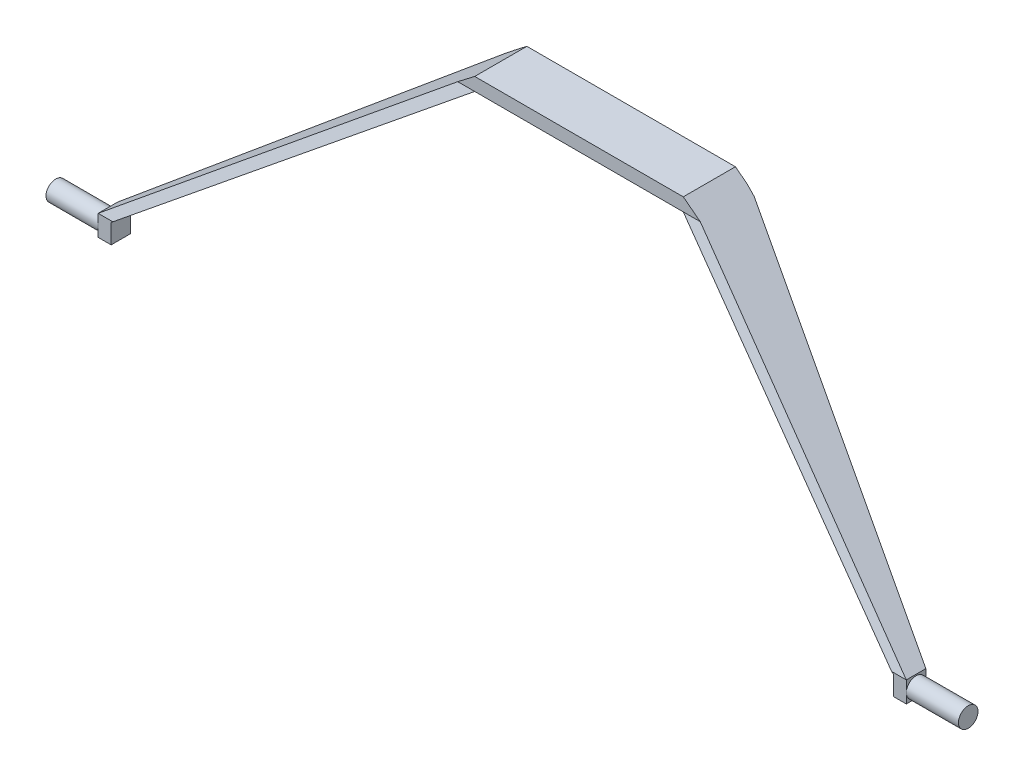
ISO-10303-21;
HEADER;
FILE_DESCRIPTION(('STEP AP214'),'2;1');
FILE_NAME('part.step','',(''),(''),'','','');
FILE_SCHEMA(('AUTOMOTIVE_DESIGN { 1 0 10303 214 1 1 1 1 }'));
ENDSEC;
DATA;
#1=APPLICATION_CONTEXT('core data for automotive mechanical design processes');
#2=APPLICATION_PROTOCOL_DEFINITION('international standard','automotive_design',2000,#1);
#3=PRODUCT_CONTEXT('',#1,'mechanical');
#4=PRODUCT('Part','Part','',(#3));
#5=PRODUCT_RELATED_PRODUCT_CATEGORY('part','',(#4));
#6=PRODUCT_DEFINITION_FORMATION('','',#4);
#7=PRODUCT_DEFINITION_CONTEXT('part definition',#1,'design');
#8=PRODUCT_DEFINITION('design','',#6,#7);
#9=PRODUCT_DEFINITION_SHAPE('','',#8);
#10=(LENGTH_UNIT() NAMED_UNIT(*) SI_UNIT(.MILLI.,.METRE.));
#11=(NAMED_UNIT(*) PLANE_ANGLE_UNIT() SI_UNIT($,.RADIAN.));
#12=(NAMED_UNIT(*) SI_UNIT($,.STERADIAN.) SOLID_ANGLE_UNIT());
#13=UNCERTAINTY_MEASURE_WITH_UNIT(LENGTH_MEASURE(1.E-05),#10,'distance_accuracy_value','');
#14=(GEOMETRIC_REPRESENTATION_CONTEXT(3) GLOBAL_UNCERTAINTY_ASSIGNED_CONTEXT((#13)) GLOBAL_UNIT_ASSIGNED_CONTEXT((#10,
#11,#12)) REPRESENTATION_CONTEXT('',''));
#15=CARTESIAN_POINT('',(0.,0.,0.));
#16=DIRECTION('',(0.,0.,1.));
#17=DIRECTION('',(1.,0.,0.));
#18=AXIS2_PLACEMENT_3D('',#15,#16,#17);
#19=CARTESIAN_POINT('',(0.,0.,149.606));
#20=DIRECTION('',(0.,0.,1.));
#21=DIRECTION('',(1.,0.,0.));
#22=AXIS2_PLACEMENT_3D('',#19,#20,#21);
#23=PLANE('',#22);
#24=DIRECTION('',(1.,0.,0.));
#25=VECTOR('',#24,1.);
#26=CARTESIAN_POINT('',(-1119.76296506094,-207.01,149.606));
#27=LINE('',#26,#25);
#28=CARTESIAN_POINT('',(-787.4,-207.01,149.606));
#29=VERTEX_POINT('',#28);
#30=CARTESIAN_POINT('',(-758.735116505832,-207.01,149.606));
#31=VERTEX_POINT('',#30);
#32=EDGE_CURVE('E213',#29,#31,#27,.T.);
#33=ORIENTED_EDGE('',*,*,#32,.F.);
#34=DIRECTION('',(-0.0017633769855496,-0.999998445249595,0.));
#35=VECTOR('',#34,1.);
#36=CARTESIAN_POINT('',(-787.4,-207.01,149.606));
#37=LINE('',#36,#35);
#38=CARTESIAN_POINT('',(-787.438071420537,-228.600029617996,149.606));
#39=VERTEX_POINT('',#38);
#40=EDGE_CURVE('E273',#29,#39,#37,.T.);
#41=ORIENTED_EDGE('',*,*,#40,.T.);
#42=CARTESIAN_POINT('',(-787.471663752112,-247.65,149.606));
#43=VERTEX_POINT('',#42);
#44=EDGE_CURVE('E268',#39,#43,#37,.T.);
#45=ORIENTED_EDGE('',*,*,#44,.T.);
#46=DIRECTION('',(1.,0.,0.));
#47=VECTOR('',#46,1.);
#48=CARTESIAN_POINT('',(-787.471663752112,-247.65,149.606));
#49=LINE('',#48,#47);
#50=CARTESIAN_POINT('',(-762.071663752112,-247.65,149.606));
#51=VERTEX_POINT('',#50);
#52=EDGE_CURVE('E276',#43,#51,#49,.T.);
#53=ORIENTED_EDGE('',*,*,#52,.T.);
#54=DIRECTION('',(0.,1.,0.));
#55=VECTOR('',#54,1.);
#56=CARTESIAN_POINT('',(-762.071663752112,-247.65,149.606));
#57=LINE('',#56,#55);
#58=CARTESIAN_POINT('',(-762.071663752113,-209.55,149.606));
#59=VERTEX_POINT('',#58);
#60=EDGE_CURVE('E279',#51,#59,#57,.T.);
#61=ORIENTED_EDGE('',*,*,#60,.T.);
#62=DIRECTION('',(0.795676661320879,0.605721594983421,0.));
#63=VECTOR('',#62,1.);
#64=CARTESIAN_POINT('',(-762.071663752113,-209.55,149.606));
#65=LINE('',#64,#63);
#66=EDGE_CURVE('E282',#59,#31,#65,.T.);
#67=ORIENTED_EDGE('',*,*,#66,.T.);
#68=EDGE_LOOP('',(#33,#41,#45,#53,#61,#67));
#69=FACE_BOUND('',#68,.T.);
#70=ADVANCED_FACE('F40',(#69),#23,.T.);
#71=CARTESIAN_POINT('',(787.471663752112,-247.65,149.606));
#72=DIRECTION('',(-0.999998445249595,-0.0017633769855496,0.));
#73=DIRECTION('',(0.0017633769855496,-0.999998445249595,0.));
#74=AXIS2_PLACEMENT_3D('',#71,#72,#73);
#75=PLANE('',#74);
#76=DIRECTION('',(0.,0.,-1.));
#77=VECTOR('',#76,1.);
#78=CARTESIAN_POINT('',(787.471663752112,-247.65,11.43));
#79=LINE('',#78,#77);
#80=CARTESIAN_POINT('',(787.471663752112,-247.65,130.556));
#81=VERTEX_POINT('',#80);
#82=CARTESIAN_POINT('',(787.471663752112,-247.65,111.506));
#83=VERTEX_POINT('',#82);
#84=EDGE_CURVE('E342',#81,#83,#79,.T.);
#85=ORIENTED_EDGE('',*,*,#84,.T.);
#86=DIRECTION('',(-0.0017633769855496,0.999998445249595,0.));
#87=VECTOR('',#86,1.);
#88=CARTESIAN_POINT('',(787.471663752112,-247.65,111.506));
#89=LINE('',#88,#87);
#90=CARTESIAN_POINT('',(787.438071420537,-228.600029617996,111.506));
#91=VERTEX_POINT('',#90);
#92=EDGE_CURVE('E241',#83,#91,#89,.T.);
#93=ORIENTED_EDGE('',*,*,#92,.T.);
#94=CARTESIAN_POINT('',(787.438071420537,-228.600029617996,130.556));
#95=DIRECTION('',(0.999998445249595,0.0017633769855496,0.));
#96=DIRECTION('',(-0.0017633769855496,0.999998445249595,0.));
#97=AXIS2_PLACEMENT_3D('',#94,#95,#96);
#98=CIRCLE('',#97,19.05);
#99=EDGE_CURVE('E272',#81,#91,#98,.T.);
#100=ORIENTED_EDGE('',*,*,#99,.F.);
#101=EDGE_LOOP('',(#85,#93,#100));
#102=FACE_BOUND('',#101,.T.);
#103=ADVANCED_FACE('F410',(#102),#75,.F.);
#104=CARTESIAN_POINT('',(-787.4,-207.01,149.606));
#105=DIRECTION('',(0.999998445249595,-0.0017633769855496,0.));
#106=DIRECTION('',(0.0017633769855496,0.999998445249595,0.));
#107=AXIS2_PLACEMENT_3D('',#104,#105,#106);
#108=PLANE('',#107);
#109=DIRECTION('',(0.,0.,-1.));
#110=VECTOR('',#109,1.);
#111=CARTESIAN_POINT('',(-787.4,-207.01,11.43));
#112=LINE('',#111,#110);
#113=CARTESIAN_POINT('',(-787.4,-207.01,111.506));
#114=VERTEX_POINT('',#113);
#115=EDGE_CURVE('E334',#29,#114,#112,.T.);
#116=ORIENTED_EDGE('',*,*,#115,.T.);
#117=DIRECTION('',(-0.0017633769855496,-0.999998445249595,0.));
#118=VECTOR('',#117,1.);
#119=CARTESIAN_POINT('',(-787.4,-207.01,111.506));
#120=LINE('',#119,#118);
#121=CARTESIAN_POINT('',(-787.438071420537,-228.600029617996,111.506));
#122=VERTEX_POINT('',#121);
#123=EDGE_CURVE('E238',#114,#122,#120,.T.);
#124=ORIENTED_EDGE('',*,*,#123,.T.);
#125=CARTESIAN_POINT('',(-787.438071420537,-228.600029617996,130.556));
#126=DIRECTION('',(0.999998445249595,-0.0017633769855496,0.));
#127=DIRECTION('',(0.0017633769855496,0.999998445249595,0.));
#128=AXIS2_PLACEMENT_3D('',#125,#126,#127);
#129=CIRCLE('',#128,19.05);
#130=EDGE_CURVE('E256',#122,#39,#129,.T.);
#131=ORIENTED_EDGE('',*,*,#130,.T.);
#132=ORIENTED_EDGE('',*,*,#40,.F.);
#133=EDGE_LOOP('',(#116,#124,#131,#132));
#134=FACE_BOUND('',#133,.T.);
#135=ADVANCED_FACE('F392',(#134),#108,.F.);
#136=ORIENTED_EDGE('',*,*,#44,.F.);
#137=CARTESIAN_POINT('',(-787.471663752112,-247.65,130.556));
#138=VERTEX_POINT('',#137);
#139=EDGE_CURVE('E261',#39,#138,#129,.T.);
#140=ORIENTED_EDGE('',*,*,#139,.T.);
#141=DIRECTION('',(0.,0.,-1.));
#142=VECTOR('',#141,1.);
#143=CARTESIAN_POINT('',(-787.471663752112,-247.65,11.43));
#144=LINE('',#143,#142);
#145=EDGE_CURVE('E331',#43,#138,#144,.T.);
#146=ORIENTED_EDGE('',*,*,#145,.F.);
#147=EDGE_LOOP('',(#136,#140,#146));
#148=FACE_BOUND('',#147,.T.);
#149=ADVANCED_FACE('F399',(#148),#108,.F.);
#150=CARTESIAN_POINT('',(787.438071420537,-228.600029617996,149.606));
#151=VERTEX_POINT('',#150);
#152=EDGE_CURVE('E260',#91,#151,#98,.T.);
#153=ORIENTED_EDGE('',*,*,#152,.F.);
#154=CARTESIAN_POINT('',(787.4,-207.01,111.506));
#155=VERTEX_POINT('',#154);
#156=EDGE_CURVE('E237',#91,#155,#89,.T.);
#157=ORIENTED_EDGE('',*,*,#156,.T.);
#158=DIRECTION('',(0.,0.,-1.));
#159=VECTOR('',#158,1.);
#160=CARTESIAN_POINT('',(787.4,-207.01,11.43));
#161=LINE('',#160,#159);
#162=CARTESIAN_POINT('',(787.4,-207.01,149.606));
#163=VERTEX_POINT('',#162);
#164=EDGE_CURVE('E340',#163,#155,#161,.T.);
#165=ORIENTED_EDGE('',*,*,#164,.F.);
#166=DIRECTION('',(-0.0017633769855496,0.999998445249595,0.));
#167=VECTOR('',#166,1.);
#168=CARTESIAN_POINT('',(787.471663752112,-247.65,149.606));
#169=LINE('',#168,#167);
#170=EDGE_CURVE('E293',#151,#163,#169,.T.);
#171=ORIENTED_EDGE('',*,*,#170,.F.);
#172=EDGE_LOOP('',(#153,#157,#165,#171));
#173=FACE_BOUND('',#172,.T.);
#174=ADVANCED_FACE('F401',(#173),#75,.F.);
#175=CARTESIAN_POINT('',(0.,215.9,11.43));
#176=DIRECTION('',(0.,-1.,0.));
#177=DIRECTION('',(1.,0.,0.));
#178=AXIS2_PLACEMENT_3D('',#175,#176,#177);
#179=PLANE('',#178);
#180=DIRECTION('',(1.,0.,0.));
#181=VECTOR('',#180,1.);
#182=CARTESIAN_POINT('',(-1119.76296506094,215.9,0.));
#183=LINE('',#182,#181);
#184=CARTESIAN_POINT('',(-203.2,215.9,0.));
#185=VERTEX_POINT('',#184);
#186=CARTESIAN_POINT('',(203.2,215.9,0.));
#187=VERTEX_POINT('',#186);
#188=EDGE_CURVE('E190',#185,#187,#183,.T.);
#189=ORIENTED_EDGE('',*,*,#188,.F.);
#190=DIRECTION('',(0.,0.,-1.));
#191=VECTOR('',#190,1.);
#192=CARTESIAN_POINT('',(-203.2,215.9,11.43));
#193=LINE('',#192,#191);
#194=CARTESIAN_POINT('',(-203.2,215.9,-100.20306796752));
#195=VERTEX_POINT('',#194);
#196=EDGE_CURVE('E322',#185,#195,#193,.T.);
#197=ORIENTED_EDGE('',*,*,#196,.T.);
#198=DIRECTION('',(-1.,0.,0.));
#199=VECTOR('',#198,1.);
#200=CARTESIAN_POINT('',(787.472663752112,215.9,-100.20306796752));
#201=LINE('',#200,#199);
#202=CARTESIAN_POINT('',(203.2,215.9,-100.20306796752));
#203=VERTEX_POINT('',#202);
#204=EDGE_CURVE('E303',#203,#195,#201,.T.);
#205=ORIENTED_EDGE('',*,*,#204,.F.);
#206=DIRECTION('',(0.,0.,-1.));
#207=VECTOR('',#206,1.);
#208=CARTESIAN_POINT('',(203.2,215.9,11.43));
#209=LINE('',#208,#207);
#210=EDGE_CURVE('E351',#187,#203,#209,.T.);
#211=ORIENTED_EDGE('',*,*,#210,.F.);
#212=EDGE_LOOP('',(#189,#197,#205,#211));
#213=FACE_BOUND('',#212,.T.);
#214=ADVANCED_FACE('F42',(#213),#179,.T.);
#215=CARTESIAN_POINT('',(178.608653813682,234.620555922852,11.43));
#216=DIRECTION('',(-0.605721594983422,-0.795676661320878,0.));
#217=DIRECTION('',(0.795676661320878,-0.605721594983422,0.));
#218=AXIS2_PLACEMENT_3D('',#215,#216,#217);
#219=PLANE('',#218);
#220=DIRECTION('',(0.77801606277515,-0.59227718164381,0.209520276269192));
#221=VECTOR('',#220,1.);
#222=CARTESIAN_POINT('',(181.551388982781,232.380351670435,-5.82998626659829));
#223=LINE('',#222,#221);
#224=CARTESIAN_POINT('',(758.735116505831,-207.01,149.606));
#225=VERTEX_POINT('',#224);
#226=EDGE_CURVE('E54',#187,#225,#223,.T.);
#227=ORIENTED_EDGE('',*,*,#226,.F.);
#228=ORIENTED_EDGE('',*,*,#210,.T.);
#229=DIRECTION('',(-0.791351832413663,0.602429249749417,-0.104121450152652));
#230=VECTOR('',#229,1.);
#231=CARTESIAN_POINT('',(777.978728145512,-221.659507396986,-24.5770414138541));
#232=LINE('',#231,#230);
#233=CARTESIAN_POINT('',(208.742704606347,211.680527395255,-99.4737912820534));
#234=VERTEX_POINT('',#233);
#235=EDGE_CURVE('E311',#234,#203,#232,.T.);
#236=ORIENTED_EDGE('',*,*,#235,.F.);
#237=DIRECTION('',(-0.761016790513311,0.579336213523788,-0.291929779667542));
#238=VECTOR('',#237,1.);
#239=CARTESIAN_POINT('',(205.815538351083,213.908879562801,-100.596666638552));
#240=LINE('',#239,#238);
#241=CARTESIAN_POINT('',(758.73511650583,-207.01,111.506));
#242=VERTEX_POINT('',#241);
#243=EDGE_CURVE('E62',#242,#234,#240,.T.);
#244=ORIENTED_EDGE('',*,*,#243,.F.);
#245=DIRECTION('',(-0.795676661320878,0.605721594983422,0.));
#246=VECTOR('',#245,1.);
#247=CARTESIAN_POINT('',(178.608653813682,234.620555922852,111.506));
#248=LINE('',#247,#246);
#249=CARTESIAN_POINT('',(762.071663752112,-209.55,111.506));
#250=VERTEX_POINT('',#249);
#251=EDGE_CURVE('E250',#250,#242,#248,.T.);
#252=ORIENTED_EDGE('',*,*,#251,.F.);
#253=DIRECTION('',(0.,0.,-1.));
#254=VECTOR('',#253,1.);
#255=CARTESIAN_POINT('',(762.071663752112,-209.55,11.43));
#256=LINE('',#255,#254);
#257=CARTESIAN_POINT('',(762.071663752112,-209.55,149.606));
#258=VERTEX_POINT('',#257);
#259=EDGE_CURVE('E348',#258,#250,#256,.T.);
#260=ORIENTED_EDGE('',*,*,#259,.F.);
#261=DIRECTION('',(0.795676661320878,-0.605721594983422,0.));
#262=VECTOR('',#261,1.);
#263=CARTESIAN_POINT('',(203.2,215.9,149.606));
#264=LINE('',#263,#262);
#265=EDGE_CURVE('E285',#225,#258,#264,.T.);
#266=ORIENTED_EDGE('',*,*,#265,.F.);
#267=EDGE_LOOP('',(#227,#228,#236,#244,#252,#260,#266));
#268=FACE_BOUND('',#267,.T.);
#269=ADVANCED_FACE('F440',(#268),#219,.T.);
#270=CARTESIAN_POINT('',(191.85340904021,250.007275236534,11.43));
#271=DIRECTION('',(-0.608793543514713,-0.793328696931353,0.));
#272=DIRECTION('',(0.793328696931353,-0.608793543514713,0.));
#273=AXIS2_PLACEMENT_3D('',#270,#271,#272);
#274=PLANE('',#273);
#275=DIRECTION('',(0.,0.,-1.));
#276=VECTOR('',#275,1.);
#277=CARTESIAN_POINT('',(203.2,241.3,11.43));
#278=LINE('',#277,#276);
#279=CARTESIAN_POINT('',(203.2,241.3,0.));
#280=VERTEX_POINT('',#279);
#281=CARTESIAN_POINT('',(203.2,241.3,-101.6));
#282=VERTEX_POINT('',#281);
#283=EDGE_CURVE('E205',#280,#282,#278,.T.);
#284=ORIENTED_EDGE('',*,*,#283,.F.);
#285=DIRECTION('',(0.793328696931353,-0.608793543514713,0.));
#286=VECTOR('',#285,1.);
#287=CARTESIAN_POINT('',(780.057619536937,-201.375521079432,0.));
#288=LINE('',#287,#286);
#289=CARTESIAN_POINT('',(236.299150141643,215.9,0.));
#290=VERTEX_POINT('',#289);
#291=EDGE_CURVE('E187',#280,#290,#288,.T.);
#292=ORIENTED_EDGE('',*,*,#291,.T.);
#293=DIRECTION('',(0.775547130812144,-0.595148124297146,0.210535883009621));
#294=VECTOR('',#293,1.);
#295=CARTESIAN_POINT('',(767.679092369877,-191.876346970797,144.252413432913));
#296=LINE('',#295,#294);
#297=EDGE_CURVE('E195',#290,#163,#296,.T.);
#298=ORIENTED_EDGE('',*,*,#297,.T.);
#299=ORIENTED_EDGE('',*,*,#164,.T.);
#300=DIRECTION('',(-0.758442535339165,0.582022206466794,-0.293283261997381));
#301=VECTOR('',#300,1.);
#302=CARTESIAN_POINT('',(797.809477249187,-214.998142323833,115.531256101919));
#303=LINE('',#302,#301);
#304=CARTESIAN_POINT('',(241.797613026013,211.680527395255,-99.4737912820534));
#305=VERTEX_POINT('',#304);
#306=EDGE_CURVE('E220',#155,#305,#303,.T.);
#307=ORIENTED_EDGE('',*,*,#306,.T.);
#308=DIRECTION('',(-0.788973141974178,0.605451128514967,-0.104643739532502));
#309=VECTOR('',#308,1.);
#310=CARTESIAN_POINT('',(788.694795319994,-208.003614669474,-26.9372710250642));
#311=LINE('',#310,#309);
#312=CARTESIAN_POINT('',(225.766825324947,223.982414478899,-101.6));
#313=VERTEX_POINT('',#312);
#314=EDGE_CURVE('E309',#305,#313,#311,.T.);
#315=ORIENTED_EDGE('',*,*,#314,.T.);
#316=DIRECTION('',(-0.793328696931354,0.608793543514713,0.));
#317=VECTOR('',#316,1.);
#318=CARTESIAN_POINT('',(191.85340904021,250.007275236534,-101.6));
#319=LINE('',#318,#317);
#320=EDGE_CURVE('E314',#313,#282,#319,.T.);
#321=ORIENTED_EDGE('',*,*,#320,.T.);
#322=EDGE_LOOP('',(#284,#292,#298,#299,#307,#315,#321));
#323=FACE_BOUND('',#322,.T.);
#324=ADVANCED_FACE('F203',(#323),#274,.F.);
#325=CARTESIAN_POINT('',(-191.85340904021,250.007275236534,11.43));
#326=DIRECTION('',(-0.608793543514713,0.793328696931354,0.));
#327=DIRECTION('',(-0.793328696931354,-0.608793543514713,0.));
#328=AXIS2_PLACEMENT_3D('',#325,#326,#327);
#329=PLANE('',#328);
#330=DIRECTION('',(0.793328696931354,0.608793543514713,0.));
#331=VECTOR('',#330,1.);
#332=CARTESIAN_POINT('',(-780.057619536937,-201.375521079433,0.));
#333=LINE('',#332,#331);
#334=CARTESIAN_POINT('',(-236.299150141643,215.9,0.));
#335=VERTEX_POINT('',#334);
#336=CARTESIAN_POINT('',(-203.2,241.3,0.));
#337=VERTEX_POINT('',#336);
#338=EDGE_CURVE('E200',#335,#337,#333,.T.);
#339=ORIENTED_EDGE('',*,*,#338,.T.);
#340=DIRECTION('',(0.,0.,-1.));
#341=VECTOR('',#340,1.);
#342=CARTESIAN_POINT('',(-203.2,241.3,11.43));
#343=LINE('',#342,#341);
#344=CARTESIAN_POINT('',(-203.2,241.3,-101.6));
#345=VERTEX_POINT('',#344);
#346=EDGE_CURVE('E337',#337,#345,#343,.T.);
#347=ORIENTED_EDGE('',*,*,#346,.T.);
#348=DIRECTION('',(0.793328696931354,0.608793543514713,0.));
#349=VECTOR('',#348,1.);
#350=CARTESIAN_POINT('',(-191.85340904021,250.007275236534,-101.6));
#351=LINE('',#350,#349);
#352=CARTESIAN_POINT('',(-225.766825324947,223.982414478899,-101.6));
#353=VERTEX_POINT('',#352);
#354=EDGE_CURVE('E319',#353,#345,#351,.T.);
#355=ORIENTED_EDGE('',*,*,#354,.F.);
#356=DIRECTION('',(-0.788973141974178,-0.605451128514967,0.104643739532502));
#357=VECTOR('',#356,1.);
#358=CARTESIAN_POINT('',(-788.694795319994,-208.003614669474,-26.9372710250643));
#359=LINE('',#358,#357);
#360=CARTESIAN_POINT('',(-241.797613026013,211.680527395255,-99.4737912820534));
#361=VERTEX_POINT('',#360);
#362=EDGE_CURVE('E300',#353,#361,#359,.T.);
#363=ORIENTED_EDGE('',*,*,#362,.T.);
#364=DIRECTION('',(-0.758442535339165,-0.582022206466794,0.293283261997381));
#365=VECTOR('',#364,1.);
#366=CARTESIAN_POINT('',(-797.809477249187,-214.998142323833,115.531256101919));
#367=LINE('',#366,#365);
#368=EDGE_CURVE('E224',#361,#114,#367,.T.);
#369=ORIENTED_EDGE('',*,*,#368,.T.);
#370=ORIENTED_EDGE('',*,*,#115,.F.);
#371=DIRECTION('',(0.775547130812144,0.595148124297145,-0.210535883009621));
#372=VECTOR('',#371,1.);
#373=CARTESIAN_POINT('',(-767.679092369878,-191.876346970797,144.252413432913));
#374=LINE('',#373,#372);
#375=EDGE_CURVE('E191',#29,#335,#374,.T.);
#376=ORIENTED_EDGE('',*,*,#375,.T.);
#377=EDGE_LOOP('',(#339,#347,#355,#363,#369,#370,#376));
#378=FACE_BOUND('',#377,.T.);
#379=ADVANCED_FACE('F467',(#378),#329,.T.);
#380=CARTESIAN_POINT('',(762.071663752112,0.,11.43));
#381=DIRECTION('',(-1.,0.,0.));
#382=DIRECTION('',(0.,0.,1.));
#383=AXIS2_PLACEMENT_3D('',#380,#381,#382);
#384=PLANE('',#383);
#385=DIRECTION('',(0.,1.,0.));
#386=VECTOR('',#385,1.);
#387=CARTESIAN_POINT('',(762.071663752112,0.,111.506));
#388=LINE('',#387,#386);
#389=CARTESIAN_POINT('',(762.071663752112,-247.65,111.506));
#390=VERTEX_POINT('',#389);
#391=EDGE_CURVE('E248',#390,#250,#388,.T.);
#392=ORIENTED_EDGE('',*,*,#391,.F.);
#393=DIRECTION('',(0.,0.,-1.));
#394=VECTOR('',#393,1.);
#395=CARTESIAN_POINT('',(762.071663752112,-247.65,11.43));
#396=LINE('',#395,#394);
#397=CARTESIAN_POINT('',(762.071663752112,-247.65,149.606));
#398=VERTEX_POINT('',#397);
#399=EDGE_CURVE('E345',#398,#390,#396,.T.);
#400=ORIENTED_EDGE('',*,*,#399,.F.);
#401=DIRECTION('',(0.,-1.,0.));
#402=VECTOR('',#401,1.);
#403=CARTESIAN_POINT('',(762.071663752112,-209.55,149.606));
#404=LINE('',#403,#402);
#405=EDGE_CURVE('E287',#258,#398,#404,.T.);
#406=ORIENTED_EDGE('',*,*,#405,.F.);
#407=ORIENTED_EDGE('',*,*,#259,.T.);
#408=EDGE_LOOP('',(#392,#400,#406,#407));
#409=FACE_BOUND('',#408,.T.);
#410=ADVANCED_FACE('F445',(#409),#384,.T.);
#411=CARTESIAN_POINT('',(0.,-247.65,11.43));
#412=DIRECTION('',(0.,-1.,0.));
#413=DIRECTION('',(0.,0.,-1.));
#414=AXIS2_PLACEMENT_3D('',#411,#412,#413);
#415=PLANE('',#414);
#416=DIRECTION('',(1.,0.,0.));
#417=VECTOR('',#416,1.);
#418=CARTESIAN_POINT('',(-1212.43977021963,-247.65,111.506));
#419=LINE('',#418,#417);
#420=EDGE_CURVE('E223',#390,#83,#419,.T.);
#421=ORIENTED_EDGE('',*,*,#420,.T.);
#422=ORIENTED_EDGE('',*,*,#84,.F.);
#423=CARTESIAN_POINT('',(787.471663752112,-247.65,149.606));
#424=VERTEX_POINT('',#423);
#425=EDGE_CURVE('E343',#424,#81,#79,.T.);
#426=ORIENTED_EDGE('',*,*,#425,.F.);
#427=DIRECTION('',(1.,0.,0.));
#428=VECTOR('',#427,1.);
#429=CARTESIAN_POINT('',(762.071663752112,-247.65,149.606));
#430=LINE('',#429,#428);
#431=EDGE_CURVE('E290',#398,#424,#430,.T.);
#432=ORIENTED_EDGE('',*,*,#431,.F.);
#433=ORIENTED_EDGE('',*,*,#399,.T.);
#434=EDGE_LOOP('',(#421,#422,#426,#432,#433));
#435=FACE_BOUND('',#434,.T.);
#436=ADVANCED_FACE('F449',(#435),#415,.T.);
#437=CARTESIAN_POINT('',(-178.608653813682,234.620555922852,11.43));
#438=DIRECTION('',(-0.605721594983422,0.795676661320878,0.));
#439=DIRECTION('',(-0.795676661320878,-0.605721594983422,0.));
#440=AXIS2_PLACEMENT_3D('',#437,#438,#439);
#441=PLANE('',#440);
#442=ORIENTED_EDGE('',*,*,#196,.F.);
#443=DIRECTION('',(-0.778016062775151,-0.59227718164381,0.209520276269191));
#444=VECTOR('',#443,1.);
#445=CARTESIAN_POINT('',(-181.551388982781,232.380351670435,-5.82998626659831));
#446=LINE('',#445,#444);
#447=EDGE_CURVE('E216',#185,#31,#446,.T.);
#448=ORIENTED_EDGE('',*,*,#447,.T.);
#449=ORIENTED_EDGE('',*,*,#66,.F.);
#450=DIRECTION('',(0.,0.,-1.));
#451=VECTOR('',#450,1.);
#452=CARTESIAN_POINT('',(-762.071663752112,-209.55,11.43));
#453=LINE('',#452,#451);
#454=CARTESIAN_POINT('',(-762.071663752112,-209.55,111.506));
#455=VERTEX_POINT('',#454);
#456=EDGE_CURVE('E324',#59,#455,#453,.T.);
#457=ORIENTED_EDGE('',*,*,#456,.T.);
#458=DIRECTION('',(0.795676661320878,0.605721594983422,0.));
#459=VECTOR('',#458,1.);
#460=CARTESIAN_POINT('',(-178.608653813682,234.620555922852,111.506));
#461=LINE('',#460,#459);
#462=CARTESIAN_POINT('',(-758.735116505831,-207.01,111.506));
#463=VERTEX_POINT('',#462);
#464=EDGE_CURVE('E245',#455,#463,#461,.T.);
#465=ORIENTED_EDGE('',*,*,#464,.T.);
#466=DIRECTION('',(0.761016790513311,0.579336213523788,-0.291929779667542));
#467=VECTOR('',#466,1.);
#468=CARTESIAN_POINT('',(-205.815538351083,213.908879562801,-100.596666638552));
#469=LINE('',#468,#467);
#470=CARTESIAN_POINT('',(-208.742704606347,211.680527395255,-99.4737912820534));
#471=VERTEX_POINT('',#470);
#472=EDGE_CURVE('E253',#463,#471,#469,.T.);
#473=ORIENTED_EDGE('',*,*,#472,.T.);
#474=DIRECTION('',(-0.791351832413664,-0.602429249749417,0.104121450152652));
#475=VECTOR('',#474,1.);
#476=CARTESIAN_POINT('',(-777.978728145512,-221.659507396986,-24.5770414138542));
#477=LINE('',#476,#475);
#478=EDGE_CURVE('E297',#195,#471,#477,.T.);
#479=ORIENTED_EDGE('',*,*,#478,.F.);
#480=EDGE_LOOP('',(#442,#448,#449,#457,#465,#473,#479));
#481=FACE_BOUND('',#480,.T.);
#482=ADVANCED_FACE('F362',(#481),#441,.F.);
#483=CARTESIAN_POINT('',(0.,0.,-101.6));
#484=DIRECTION('',(0.,0.,1.));
#485=DIRECTION('',(1.,0.,0.));
#486=AXIS2_PLACEMENT_3D('',#483,#484,#485);
#487=PLANE('',#486);
#488=DIRECTION('',(-1.,0.,0.));
#489=VECTOR('',#488,1.);
#490=CARTESIAN_POINT('',(787.472663752112,223.982414478899,-101.6));
#491=LINE('',#490,#489);
#492=EDGE_CURVE('E306',#313,#353,#491,.T.);
#493=ORIENTED_EDGE('',*,*,#492,.T.);
#494=ORIENTED_EDGE('',*,*,#354,.T.);
#495=DIRECTION('',(1.,0.,0.));
#496=VECTOR('',#495,1.);
#497=CARTESIAN_POINT('',(0.,241.3,-101.6));
#498=LINE('',#497,#496);
#499=EDGE_CURVE('E316',#345,#282,#498,.T.);
#500=ORIENTED_EDGE('',*,*,#499,.T.);
#501=ORIENTED_EDGE('',*,*,#320,.F.);
#502=EDGE_LOOP('',(#493,#494,#500,#501));
#503=FACE_BOUND('',#502,.T.);
#504=ADVANCED_FACE('F461',(#503),#487,.F.);
#505=CARTESIAN_POINT('',(0.,241.3,11.43));
#506=DIRECTION('',(0.,1.,0.));
#507=DIRECTION('',(-1.,0.,0.));
#508=AXIS2_PLACEMENT_3D('',#505,#506,#507);
#509=PLANE('',#508);
#510=DIRECTION('',(1.,0.,0.));
#511=VECTOR('',#510,1.);
#512=CARTESIAN_POINT('',(-1119.76296506094,241.3,0.));
#513=LINE('',#512,#511);
#514=EDGE_CURVE('E210',#337,#280,#513,.T.);
#515=ORIENTED_EDGE('',*,*,#514,.T.);
#516=ORIENTED_EDGE('',*,*,#283,.T.);
#517=ORIENTED_EDGE('',*,*,#499,.F.);
#518=ORIENTED_EDGE('',*,*,#346,.F.);
#519=EDGE_LOOP('',(#515,#516,#517,#518));
#520=FACE_BOUND('',#519,.T.);
#521=ADVANCED_FACE('F465',(#520),#509,.T.);
#522=CARTESIAN_POINT('',(0.,-247.65,11.43));
#523=DIRECTION('',(0.,1.,0.));
#524=DIRECTION('',(0.,0.,1.));
#525=AXIS2_PLACEMENT_3D('',#522,#523,#524);
#526=PLANE('',#525);
#527=CARTESIAN_POINT('',(-787.471663752112,-247.65,111.506));
#528=VERTEX_POINT('',#527);
#529=EDGE_CURVE('E330',#138,#528,#144,.T.);
#530=ORIENTED_EDGE('',*,*,#529,.T.);
#531=CARTESIAN_POINT('',(-762.071663752112,-247.65,111.506));
#532=VERTEX_POINT('',#531);
#533=EDGE_CURVE('E228',#528,#532,#419,.T.);
#534=ORIENTED_EDGE('',*,*,#533,.T.);
#535=DIRECTION('',(0.,0.,-1.));
#536=VECTOR('',#535,1.);
#537=CARTESIAN_POINT('',(-762.071663752112,-247.65,11.43));
#538=LINE('',#537,#536);
#539=EDGE_CURVE('E327',#51,#532,#538,.T.);
#540=ORIENTED_EDGE('',*,*,#539,.F.);
#541=ORIENTED_EDGE('',*,*,#52,.F.);
#542=ORIENTED_EDGE('',*,*,#145,.T.);
#543=EDGE_LOOP('',(#530,#534,#540,#541,#542));
#544=FACE_BOUND('',#543,.T.);
#545=ADVANCED_FACE('F383',(#544),#526,.F.);
#546=CARTESIAN_POINT('',(-762.071663752112,0.,11.43));
#547=DIRECTION('',(-1.,0.,0.));
#548=DIRECTION('',(0.,0.,1.));
#549=AXIS2_PLACEMENT_3D('',#546,#547,#548);
#550=PLANE('',#549);
#551=ORIENTED_EDGE('',*,*,#539,.T.);
#552=DIRECTION('',(0.,1.,0.));
#553=VECTOR('',#552,1.);
#554=CARTESIAN_POINT('',(-762.071663752112,0.,111.506));
#555=LINE('',#554,#553);
#556=EDGE_CURVE('E242',#532,#455,#555,.T.);
#557=ORIENTED_EDGE('',*,*,#556,.T.);
#558=ORIENTED_EDGE('',*,*,#456,.F.);
#559=ORIENTED_EDGE('',*,*,#60,.F.);
#560=EDGE_LOOP('',(#551,#557,#558,#559));
#561=FACE_BOUND('',#560,.T.);
#562=ADVANCED_FACE('F377',(#561),#550,.F.);
#563=CARTESIAN_POINT('',(787.472663752112,-209.55,-26.67));
#564=DIRECTION('',(0.,-0.170310911972118,-0.985390376076013));
#565=DIRECTION('',(0.,0.985390376076013,-0.170310911972118));
#566=AXIS2_PLACEMENT_3D('',#563,#564,#565);
#567=PLANE('',#566);
#568=DIRECTION('',(1.,0.,0.));
#569=VECTOR('',#568,1.);
#570=CARTESIAN_POINT('',(787.472663752112,211.680527395255,-99.4737912820534));
#571=LINE('',#570,#569);
#572=EDGE_CURVE('E48',#361,#471,#571,.T.);
#573=ORIENTED_EDGE('',*,*,#572,.F.);
#574=ORIENTED_EDGE('',*,*,#362,.F.);
#575=ORIENTED_EDGE('',*,*,#492,.F.);
#576=ORIENTED_EDGE('',*,*,#314,.F.);
#577=EDGE_CURVE('E352',#234,#305,#571,.T.);
#578=ORIENTED_EDGE('',*,*,#577,.F.);
#579=ORIENTED_EDGE('',*,*,#235,.T.);
#580=ORIENTED_EDGE('',*,*,#204,.T.);
#581=ORIENTED_EDGE('',*,*,#478,.T.);
#582=EDGE_LOOP('',(#573,#574,#575,#576,#578,#579,#580,#581));
#583=FACE_BOUND('',#582,.T.);
#584=ADVANCED_FACE('F363',(#583),#567,.T.);
#585=EDGE_CURVE('E264',#138,#122,#129,.T.);
#586=ORIENTED_EDGE('',*,*,#585,.T.);
#587=EDGE_CURVE('E234',#122,#528,#120,.T.);
#588=ORIENTED_EDGE('',*,*,#587,.T.);
#589=ORIENTED_EDGE('',*,*,#529,.F.);
#590=EDGE_LOOP('',(#586,#588,#589));
#591=FACE_BOUND('',#590,.T.);
#592=ADVANCED_FACE('F388',(#591),#108,.F.);
#593=EDGE_CURVE('E269',#151,#81,#98,.T.);
#594=ORIENTED_EDGE('',*,*,#593,.F.);
#595=EDGE_CURVE('E294',#424,#151,#169,.T.);
#596=ORIENTED_EDGE('',*,*,#595,.F.);
#597=ORIENTED_EDGE('',*,*,#425,.T.);
#598=EDGE_LOOP('',(#594,#596,#597));
#599=FACE_BOUND('',#598,.T.);
#600=ADVANCED_FACE('F409',(#599),#75,.F.);
#601=DIRECTION('',(1.,0.,0.));
#602=VECTOR('',#601,1.);
#603=CARTESIAN_POINT('',(0.,-207.01,149.606));
#604=LINE('',#603,#602);
#605=EDGE_CURVE('E11',#225,#163,#604,.T.);
#606=ORIENTED_EDGE('',*,*,#605,.F.);
#607=ORIENTED_EDGE('',*,*,#265,.T.);
#608=ORIENTED_EDGE('',*,*,#405,.T.);
#609=ORIENTED_EDGE('',*,*,#431,.T.);
#610=ORIENTED_EDGE('',*,*,#595,.T.);
#611=ORIENTED_EDGE('',*,*,#170,.T.);
#612=EDGE_LOOP('',(#606,#607,#608,#609,#610,#611));
#613=FACE_BOUND('',#612,.T.);
#614=ADVANCED_FACE('F416',(#613),#23,.T.);
#615=CARTESIAN_POINT('',(889.037913457896,-228.420870516264,130.556));
#616=DIRECTION('',(-0.999998445249595,-0.0017633769855496,0.));
#617=DIRECTION('',(0.0017633769855496,-0.999998445249595,0.));
#618=AXIS2_PLACEMENT_3D('',#615,#616,#617);
#619=CYLINDRICAL_SURFACE('',#618,19.05);
#620=ORIENTED_EDGE('',*,*,#99,.T.);
#621=ORIENTED_EDGE('',*,*,#152,.T.);
#622=ORIENTED_EDGE('',*,*,#593,.T.);
#623=EDGE_LOOP('',(#620,#621,#622));
#624=FACE_BOUND('',#623,.T.);
#625=CARTESIAN_POINT('',(889.037913457896,-228.420870516264,130.556));
#626=DIRECTION('',(0.999998445249595,0.0017633769855496,0.));
#627=DIRECTION('',(-0.0017633769855496,0.999998445249595,0.));
#628=AXIS2_PLACEMENT_3D('',#625,#626,#627);
#629=CIRCLE('',#628,19.05);
#630=CARTESIAN_POINT('',(889.004321126321,-209.370900134259,130.556));
#631=VERTEX_POINT('',#630);
#632=EDGE_CURVE('E265',#631,#631,#629,.T.);
#633=ORIENTED_EDGE('',*,*,#632,.F.);
#634=EDGE_LOOP('',(#633));
#635=FACE_BOUND('',#634,.T.);
#636=ADVANCED_FACE('F424',(#624,#635),#619,.T.);
#637=CARTESIAN_POINT('',(889.037913457896,-228.420870516264,130.556));
#638=DIRECTION('',(0.999998445249595,0.0017633769855496,0.));
#639=DIRECTION('',(-0.0017633769855496,0.999998445249595,0.));
#640=AXIS2_PLACEMENT_3D('',#637,#638,#639);
#641=PLANE('',#640);
#642=ORIENTED_EDGE('',*,*,#632,.T.);
#643=EDGE_LOOP('',(#642));
#644=FACE_BOUND('',#643,.T.);
#645=ADVANCED_FACE('F431',(#644),#641,.T.);
#646=CARTESIAN_POINT('',(-889.037913457896,-228.420870516264,130.556));
#647=DIRECTION('',(0.999998445249595,-0.0017633769855496,0.));
#648=DIRECTION('',(0.0017633769855496,0.999998445249595,0.));
#649=AXIS2_PLACEMENT_3D('',#646,#647,#648);
#650=CYLINDRICAL_SURFACE('',#649,19.05);
#651=CARTESIAN_POINT('',(-889.037913457896,-228.420870516264,130.556));
#652=DIRECTION('',(0.999998445249595,-0.0017633769855496,0.));
#653=DIRECTION('',(0.0017633769855496,0.999998445249595,0.));
#654=AXIS2_PLACEMENT_3D('',#651,#652,#653);
#655=CIRCLE('',#654,19.05);
#656=CARTESIAN_POINT('',(-889.004321126321,-209.370900134259,130.556));
#657=VERTEX_POINT('',#656);
#658=EDGE_CURVE('E257',#657,#657,#655,.T.);
#659=ORIENTED_EDGE('',*,*,#658,.T.);
#660=EDGE_LOOP('',(#659));
#661=FACE_BOUND('',#660,.T.);
#662=ORIENTED_EDGE('',*,*,#139,.F.);
#663=ORIENTED_EDGE('',*,*,#130,.F.);
#664=ORIENTED_EDGE('',*,*,#585,.F.);
#665=EDGE_LOOP('',(#662,#663,#664));
#666=FACE_BOUND('',#665,.T.);
#667=ADVANCED_FACE('F396',(#661,#666),#650,.T.);
#668=CARTESIAN_POINT('',(-889.037913457896,-228.420870516264,130.556));
#669=DIRECTION('',(-0.999998445249595,0.0017633769855496,0.));
#670=DIRECTION('',(0.0017633769855496,0.999998445249595,0.));
#671=AXIS2_PLACEMENT_3D('',#668,#669,#670);
#672=PLANE('',#671);
#673=ORIENTED_EDGE('',*,*,#658,.F.);
#674=EDGE_LOOP('',(#673));
#675=FACE_BOUND('',#674,.T.);
#676=ADVANCED_FACE('F521',(#675),#672,.T.);
#677=CARTESIAN_POINT('',(-1212.43977021963,-207.01,111.506));
#678=DIRECTION('',(0.,0.,1.));
#679=DIRECTION('',(1.,0.,0.));
#680=AXIS2_PLACEMENT_3D('',#677,#678,#679);
#681=PLANE('',#680);
#682=ORIENTED_EDGE('',*,*,#556,.F.);
#683=ORIENTED_EDGE('',*,*,#533,.F.);
#684=ORIENTED_EDGE('',*,*,#587,.F.);
#685=ORIENTED_EDGE('',*,*,#123,.F.);
#686=DIRECTION('',(1.,0.,0.));
#687=VECTOR('',#686,1.);
#688=CARTESIAN_POINT('',(-1212.43977021963,-207.01,111.506));
#689=LINE('',#688,#687);
#690=EDGE_CURVE('E231',#114,#463,#689,.T.);
#691=ORIENTED_EDGE('',*,*,#690,.T.);
#692=ORIENTED_EDGE('',*,*,#464,.F.);
#693=EDGE_LOOP('',(#682,#683,#684,#685,#691,#692));
#694=FACE_BOUND('',#693,.T.);
#695=ADVANCED_FACE('F380',(#694),#681,.F.);
#696=CARTESIAN_POINT('',(-1212.43977021963,215.9,-101.6));
#697=DIRECTION('',(0.,0.450000458681434,0.89302832384337));
#698=DIRECTION('',(0.,-0.89302832384337,0.450000458681434));
#699=AXIS2_PLACEMENT_3D('',#696,#697,#698);
#700=PLANE('',#699);
#701=ORIENTED_EDGE('',*,*,#690,.F.);
#702=ORIENTED_EDGE('',*,*,#368,.F.);
#703=ORIENTED_EDGE('',*,*,#572,.T.);
#704=ORIENTED_EDGE('',*,*,#472,.F.);
#705=EDGE_LOOP('',(#701,#702,#703,#704));
#706=FACE_BOUND('',#705,.T.);
#707=ADVANCED_FACE('F357',(#706),#700,.F.);
#708=ORIENTED_EDGE('',*,*,#420,.F.);
#709=ORIENTED_EDGE('',*,*,#391,.T.);
#710=ORIENTED_EDGE('',*,*,#251,.T.);
#711=EDGE_CURVE('E227',#242,#155,#689,.T.);
#712=ORIENTED_EDGE('',*,*,#711,.T.);
#713=ORIENTED_EDGE('',*,*,#156,.F.);
#714=ORIENTED_EDGE('',*,*,#92,.F.);
#715=EDGE_LOOP('',(#708,#709,#710,#712,#713,#714));
#716=FACE_BOUND('',#715,.T.);
#717=ADVANCED_FACE('F477',(#716),#681,.F.);
#718=ORIENTED_EDGE('',*,*,#243,.T.);
#719=ORIENTED_EDGE('',*,*,#577,.T.);
#720=ORIENTED_EDGE('',*,*,#306,.F.);
#721=ORIENTED_EDGE('',*,*,#711,.F.);
#722=EDGE_LOOP('',(#718,#719,#720,#721));
#723=FACE_BOUND('',#722,.T.);
#724=ADVANCED_FACE('F470',(#723),#700,.F.);
#725=CARTESIAN_POINT('',(-1119.76296506094,215.9,0.));
#726=DIRECTION('',(0.,-0.333501232315915,-0.942749663507639));
#727=DIRECTION('',(0.,0.942749663507639,-0.333501232315915));
#728=AXIS2_PLACEMENT_3D('',#725,#726,#727);
#729=PLANE('',#728);
#730=EDGE_CURVE('E193',#335,#185,#183,.T.);
#731=ORIENTED_EDGE('',*,*,#730,.F.);
#732=ORIENTED_EDGE('',*,*,#375,.F.);
#733=ORIENTED_EDGE('',*,*,#32,.T.);
#734=ORIENTED_EDGE('',*,*,#447,.F.);
#735=EDGE_LOOP('',(#731,#732,#733,#734));
#736=FACE_BOUND('',#735,.T.);
#737=ADVANCED_FACE('F468',(#736),#729,.F.);
#738=CARTESIAN_POINT('',(-1119.76296506094,241.3,0.));
#739=DIRECTION('',(0.,0.,-1.));
#740=DIRECTION('',(-1.,0.,0.));
#741=AXIS2_PLACEMENT_3D('',#738,#739,#740);
#742=PLANE('',#741);
#743=ORIENTED_EDGE('',*,*,#730,.T.);
#744=ORIENTED_EDGE('',*,*,#188,.T.);
#745=EDGE_CURVE('E182',#187,#290,#183,.T.);
#746=ORIENTED_EDGE('',*,*,#745,.T.);
#747=ORIENTED_EDGE('',*,*,#291,.F.);
#748=ORIENTED_EDGE('',*,*,#514,.F.);
#749=ORIENTED_EDGE('',*,*,#338,.F.);
#750=EDGE_LOOP('',(#743,#744,#746,#747,#748,#749));
#751=FACE_BOUND('',#750,.T.);
#752=ADVANCED_FACE('F185',(#751),#742,.F.);
#753=ORIENTED_EDGE('',*,*,#226,.T.);
#754=ORIENTED_EDGE('',*,*,#605,.T.);
#755=ORIENTED_EDGE('',*,*,#297,.F.);
#756=ORIENTED_EDGE('',*,*,#745,.F.);
#757=EDGE_LOOP('',(#753,#754,#755,#756));
#758=FACE_BOUND('',#757,.T.);
#759=ADVANCED_FACE('F196',(#758),#729,.F.);
#760=CLOSED_SHELL('',(#70,#103,#135,#149,#174,#214,#269,#324,#379,#410,#436,#482,#504,#521,#545,
#562,#584,#592,#600,#614,#636,#645,#667,#676,#695,#707,#717,#724,#737,#752,#759));
#761=MANIFOLD_SOLID_BREP('B2',#760);
#762=ADVANCED_BREP_SHAPE_REPRESENTATION('',(#18,#761),#14);
#763=SHAPE_DEFINITION_REPRESENTATION(#9,#762);
ENDSEC;
END-ISO-10303-21;
